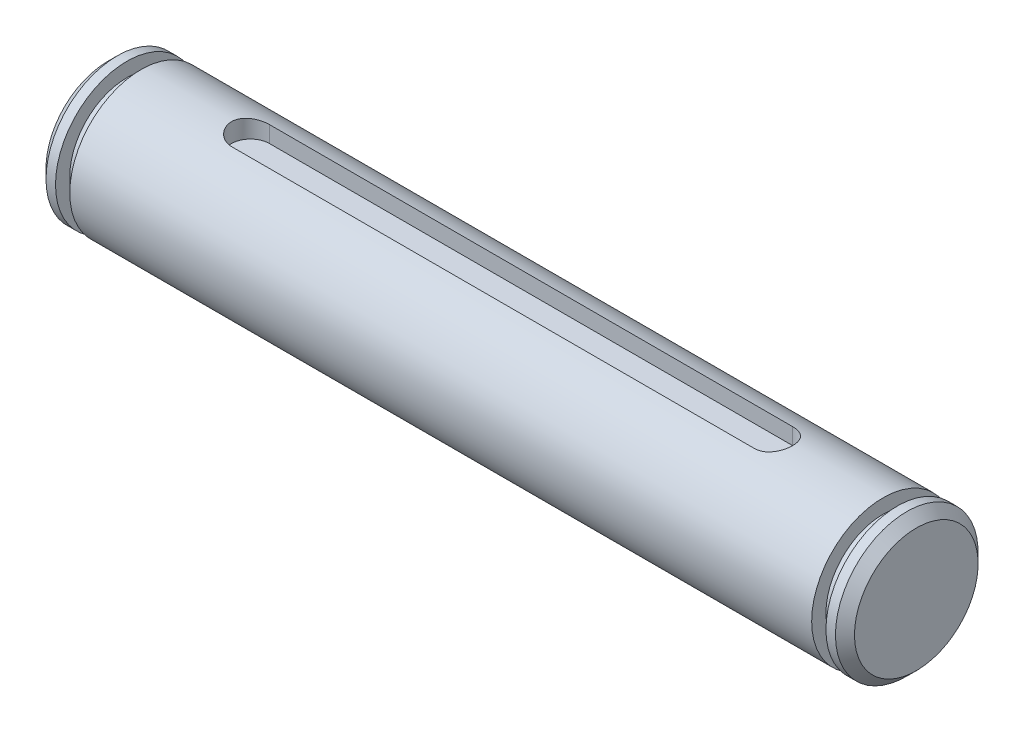
ISO-10303-21;
HEADER;
FILE_DESCRIPTION(('STEP AP214'),'2;1');
FILE_NAME('part.step','',(''),(''),'','','');
FILE_SCHEMA(('AUTOMOTIVE_DESIGN { 1 0 10303 214 1 1 1 1 }'));
ENDSEC;
DATA;
#1=APPLICATION_CONTEXT('core data for automotive mechanical design processes');
#2=APPLICATION_PROTOCOL_DEFINITION('international standard','automotive_design',2000,#1);
#3=PRODUCT_CONTEXT('',#1,'mechanical');
#4=PRODUCT('Part','Part','',(#3));
#5=PRODUCT_RELATED_PRODUCT_CATEGORY('part','',(#4));
#6=PRODUCT_DEFINITION_FORMATION('','',#4);
#7=PRODUCT_DEFINITION_CONTEXT('part definition',#1,'design');
#8=PRODUCT_DEFINITION('design','',#6,#7);
#9=PRODUCT_DEFINITION_SHAPE('','',#8);
#10=(LENGTH_UNIT() NAMED_UNIT(*) SI_UNIT(.MILLI.,.METRE.));
#11=(NAMED_UNIT(*) PLANE_ANGLE_UNIT() SI_UNIT($,.RADIAN.));
#12=(NAMED_UNIT(*) SI_UNIT($,.STERADIAN.) SOLID_ANGLE_UNIT());
#13=UNCERTAINTY_MEASURE_WITH_UNIT(LENGTH_MEASURE(1.E-05),#10,'distance_accuracy_value','');
#14=(GEOMETRIC_REPRESENTATION_CONTEXT(3) GLOBAL_UNCERTAINTY_ASSIGNED_CONTEXT((#13)) GLOBAL_UNIT_ASSIGNED_CONTEXT((#10,
#11,#12)) REPRESENTATION_CONTEXT('',''));
#15=CARTESIAN_POINT('',(0.,0.,0.));
#16=DIRECTION('',(0.,0.,1.));
#17=DIRECTION('',(1.,0.,0.));
#18=AXIS2_PLACEMENT_3D('',#15,#16,#17);
#19=CARTESIAN_POINT('',(-47.1519917646546,0.,0.));
#20=DIRECTION('',(-1.,0.,0.));
#21=DIRECTION('',(0.,0.,1.));
#22=AXIS2_PLACEMENT_3D('',#19,#20,#21);
#23=CYLINDRICAL_SURFACE('',#22,7.50000000000001);
#24=CARTESIAN_POINT('',(39.,0.,0.));
#25=DIRECTION('',(-1.,0.,0.));
#26=DIRECTION('',(0.,0.,1.));
#27=AXIS2_PLACEMENT_3D('',#24,#25,#26);
#28=CIRCLE('',#27,7.50000000000001);
#29=CARTESIAN_POINT('',(39.,0.,7.50000000000001));
#30=VERTEX_POINT('',#29);
#31=EDGE_CURVE('E125',#30,#30,#28,.T.);
#32=ORIENTED_EDGE('',*,*,#31,.T.);
#33=EDGE_LOOP('',(#32));
#34=FACE_BOUND('',#33,.T.);
#35=CARTESIAN_POINT('',(-39.,0.,0.));
#36=DIRECTION('',(-1.,0.,0.));
#37=DIRECTION('',(0.,0.,1.));
#38=AXIS2_PLACEMENT_3D('',#35,#36,#37);
#39=CIRCLE('',#38,7.5);
#40=CARTESIAN_POINT('',(-39.,0.,7.5));
#41=VERTEX_POINT('',#40);
#42=EDGE_CURVE('E122',#41,#41,#39,.T.);
#43=ORIENTED_EDGE('',*,*,#42,.F.);
#44=EDGE_LOOP('',(#43));
#45=FACE_BOUND('',#44,.T.);
#46=CARTESIAN_POINT('',(-27.5,7.22841614740049,-2.));
#47=CARTESIAN_POINT('',(-27.5551947911842,7.22841211731788,-2.00000081983303));
#48=CARTESIAN_POINT('',(-27.61036209501,7.2290491358612,-1.99771369246751));
#49=CARTESIAN_POINT('',(-27.7202814944243,7.2315637554442,-1.9885972357074));
#50=CARTESIAN_POINT('',(-27.775033665217,7.23344112607837,-1.98176874990554));
#51=CARTESIAN_POINT('',(-27.9378283928216,7.24085686185621,-1.95457557497987));
#52=CARTESIAN_POINT('',(-28.0447480667549,7.24817935036392,-1.92750268707176));
#53=CARTESIAN_POINT('',(-28.2523129563665,7.26672221014589,-1.85636209583995));
#54=CARTESIAN_POINT('',(-28.3529592563361,7.2779419056104,-1.81229733890903));
#55=CARTESIAN_POINT('',(-28.5454885830458,7.30300813868027,-1.70848322793951));
#56=CARTESIAN_POINT('',(-28.6373687012198,7.31685554362023,-1.64872869263103));
#57=CARTESIAN_POINT('',(-28.8119913216307,7.34600093818647,-1.51365040710564));
#58=CARTESIAN_POINT('',(-28.8944825380074,7.36132450422142,-1.43800740131203));
#59=CARTESIAN_POINT('',(-29.045777165694,7.39147614932697,-1.27397948568827));
#60=CARTESIAN_POINT('',(-29.114578354886,7.40630414763425,-1.18559251131008));
#61=CARTESIAN_POINT('',(-29.2375865086322,7.43408021450417,-0.996835909868382));
#62=CARTESIAN_POINT('',(-29.2915421011344,7.44699437298772,-0.896297050460056));
#63=CARTESIAN_POINT('',(-29.381686326161,7.46919170417241,-0.687177901515749));
#64=CARTESIAN_POINT('',(-29.4178787925089,7.47847566029373,-0.5785993530168));
#65=CARTESIAN_POINT('',(-29.4706549417801,7.49218546136374,-0.359117146901224));
#66=CARTESIAN_POINT('',(-29.4876686089281,7.49671766938884,-0.248323642566855));
#67=CARTESIAN_POINT('',(-29.5029571541306,7.50078525549961,-0.0253660000268802));
#68=CARTESIAN_POINT('',(-29.5012347613605,7.50032136133914,0.0867979361782012));
#69=CARTESIAN_POINT('',(-29.4794021380377,7.49452674486994,0.306314760877312));
#70=CARTESIAN_POINT('',(-29.4597568596491,7.48931908956448,0.413717637011897));
#71=CARTESIAN_POINT('',(-29.4033875010948,7.47476739620359,0.623642304521197));
#72=CARTESIAN_POINT('',(-29.3666626112576,7.46542316205161,0.726163864239475));
#73=CARTESIAN_POINT('',(-29.2768197266812,7.44346557967562,0.924604944640789));
#74=CARTESIAN_POINT('',(-29.2235422253965,7.43082062276522,1.02044860803469));
#75=CARTESIAN_POINT('',(-29.1022297041967,7.40362439329212,1.20199173400091));
#76=CARTESIAN_POINT('',(-29.0341921037115,7.38907278755842,1.28768941865435));
#77=CARTESIAN_POINT('',(-28.882831825266,7.35911436310182,1.44927650588633));
#78=CARTESIAN_POINT('',(-28.7991051392715,7.34369500037868,1.52478554150251));
#79=CARTESIAN_POINT('',(-28.6199944408082,7.31413713098088,1.66080031054576));
#80=CARTESIAN_POINT('',(-28.5246072136771,7.29999897939885,1.72130189262125));
#81=CARTESIAN_POINT('',(-28.3240420682993,7.27455088700727,1.82587959040844));
#82=CARTESIAN_POINT('',(-28.2188029001336,7.26326050655593,1.86984307275389));
#83=CARTESIAN_POINT('',(-28.0021111221114,7.24503473683016,1.93927349960346));
#84=CARTESIAN_POINT('',(-27.8906681198128,7.23809280698437,1.96476823231962));
#85=CARTESIAN_POINT('',(-27.7318620393524,7.23198573108967,1.98706167698204));
#86=CARTESIAN_POINT('',(-27.6855955577098,7.23064946437023,1.99191398956405));
#87=CARTESIAN_POINT('',(-27.5928935326918,7.22886491746628,1.99837971479533));
#88=CARTESIAN_POINT('',(-27.546458373633,7.22841523283886,1.99999825015569));
#89=CARTESIAN_POINT('',(-27.5,7.22841614740048,2.00000000000001));
#90=B_SPLINE_CURVE_WITH_KNOTS('',3,(#46,#47,#48,#49,#50,#51,#52,#53,#54,#55,#56,#57,#58,#59,#60,
#61,#62,#63,#64,#65,#66,#67,#68,#69,#70,#71,#72,#73,#74,#75,#76,#77,#78,#79,#80,#81,#82,#83,#84,
#85,#86,#87,#88,#89),.UNSPECIFIED.,.F.,.F.,(4,2,2,2,2,2,2,2,2,2,2,2,2,2,2,2,2,2,2,2,2,4),(0.,
0.165479335439025,0.330927940384255,0.660821769203833,0.990658420085614,1.32060413093786,
1.65795310683046,1.9953567954553,2.33816399210233,2.68089716794646,3.01578322846143,
3.35062050868316,3.67701110172494,4.00341716913151,4.33307162311823,4.6627837584895,
5.00258485843319,5.34247984936636,5.68464951048858,6.02630326530912,6.16582316237225,
6.30512186652119),.UNSPECIFIED.);
#91=CARTESIAN_POINT('',(-27.5,7.22841614740049,-2.));
#92=VERTEX_POINT('',#91);
#93=CARTESIAN_POINT('',(-27.5,7.22841614740048,2.00000000000001));
#94=VERTEX_POINT('',#93);
#95=EDGE_CURVE('E11',#92,#94,#90,.T.);
#96=ORIENTED_EDGE('',*,*,#95,.F.);
#97=DIRECTION('',(-1.,0.,0.));
#98=VECTOR('',#97,1.);
#99=CARTESIAN_POINT('',(-47.1519917646546,7.22841614740049,-2.));
#100=LINE('',#99,#98);
#101=CARTESIAN_POINT('',(27.5,7.22841614740048,-2.00000000000001));
#102=VERTEX_POINT('',#101);
#103=EDGE_CURVE('E59',#92,#102,#100,.F.);
#104=ORIENTED_EDGE('',*,*,#103,.T.);
#105=CARTESIAN_POINT('',(27.5,7.22841614740048,2.00000000000001));
#106=CARTESIAN_POINT('',(27.5551947911842,7.22841211731788,2.00000081983305));
#107=CARTESIAN_POINT('',(27.61036209501,7.2290491358612,1.99771369246752));
#108=CARTESIAN_POINT('',(27.7202814944243,7.23156375544419,1.98859723570741));
#109=CARTESIAN_POINT('',(27.775033665217,7.23344112607837,1.98176874990555));
#110=CARTESIAN_POINT('',(27.9378283928216,7.24085686185621,1.95457557497988));
#111=CARTESIAN_POINT('',(28.0447480667549,7.24817935036392,1.92750268707177));
#112=CARTESIAN_POINT('',(28.2523129563665,7.26672221014588,1.85636209583996));
#113=CARTESIAN_POINT('',(28.3529592563361,7.27794190561039,1.81229733890905));
#114=CARTESIAN_POINT('',(28.5454885830458,7.30300813868027,1.70848322793952));
#115=CARTESIAN_POINT('',(28.6373687012198,7.31685554362023,1.64872869263104));
#116=CARTESIAN_POINT('',(28.8119913216307,7.34600093818647,1.51365040710565));
#117=CARTESIAN_POINT('',(28.8944825380074,7.36132450422142,1.43800740131205));
#118=CARTESIAN_POINT('',(29.045777165694,7.39147614932696,1.27397948568828));
#119=CARTESIAN_POINT('',(29.114578354886,7.40630414763424,1.1855925113101));
#120=CARTESIAN_POINT('',(29.2375865086322,7.43408021450417,0.996835909868395));
#121=CARTESIAN_POINT('',(29.2915421011344,7.44699437298772,0.896297050460069));
#122=CARTESIAN_POINT('',(29.381686326161,7.46919170417241,0.687177901515762));
#123=CARTESIAN_POINT('',(29.4178787925089,7.47847566029373,0.578599353016813));
#124=CARTESIAN_POINT('',(29.4706549417801,7.49218546136374,0.359117146901236));
#125=CARTESIAN_POINT('',(29.4876686089281,7.49671766938884,0.248323642566868));
#126=CARTESIAN_POINT('',(29.5029571541306,7.50078525549961,0.0253660000268925));
#127=CARTESIAN_POINT('',(29.5012347613605,7.50032136133914,-0.0867979361781889));
#128=CARTESIAN_POINT('',(29.4794021380377,7.49452674486994,-0.3063147608773));
#129=CARTESIAN_POINT('',(29.4597568596491,7.48931908956448,-0.413717637011884));
#130=CARTESIAN_POINT('',(29.4033875010948,7.47476739620359,-0.623642304521185));
#131=CARTESIAN_POINT('',(29.3666626112576,7.46542316205161,-0.726163864239463));
#132=CARTESIAN_POINT('',(29.2768197266812,7.44346557967562,-0.924604944640777));
#133=CARTESIAN_POINT('',(29.2235422253965,7.43082062276522,-1.02044860803468));
#134=CARTESIAN_POINT('',(29.1022297041967,7.40362439329212,-1.2019917340009));
#135=CARTESIAN_POINT('',(29.0341921037115,7.38907278755843,-1.28768941865434));
#136=CARTESIAN_POINT('',(28.882831825266,7.35911436310182,-1.44927650588632));
#137=CARTESIAN_POINT('',(28.7991051392715,7.34369500037868,-1.5247855415025));
#138=CARTESIAN_POINT('',(28.6199944408082,7.31413713098088,-1.66080031054575));
#139=CARTESIAN_POINT('',(28.5246072136771,7.29999897939885,-1.72130189262124));
#140=CARTESIAN_POINT('',(28.3240420682993,7.27455088700727,-1.82587959040843));
#141=CARTESIAN_POINT('',(28.2188029001336,7.26326050655593,-1.86984307275388));
#142=CARTESIAN_POINT('',(28.0021111221114,7.24503473683016,-1.93927349960345));
#143=CARTESIAN_POINT('',(27.8906681198128,7.23809280698437,-1.96476823231961));
#144=CARTESIAN_POINT('',(27.7318620393524,7.23198573108968,-1.98706167698203));
#145=CARTESIAN_POINT('',(27.6855955577098,7.23064946437023,-1.99191398956404));
#146=CARTESIAN_POINT('',(27.5928935326918,7.22886491746629,-1.99837971479531));
#147=CARTESIAN_POINT('',(27.546458373633,7.22841523283886,-1.99999825015568));
#148=CARTESIAN_POINT('',(27.5,7.22841614740049,-2.));
#149=B_SPLINE_CURVE_WITH_KNOTS('',3,(#105,#106,#107,#108,#109,#110,#111,#112,#113,#114,#115,
#116,#117,#118,#119,#120,#121,#122,#123,#124,#125,#126,#127,#128,#129,#130,#131,#132,#133,#134,
#135,#136,#137,#138,#139,#140,#141,#142,#143,#144,#145,#146,#147,#148),.UNSPECIFIED.,.F.,.F.,(4,
2,2,2,2,2,2,2,2,2,2,2,2,2,2,2,2,2,2,2,2,4),(0.,0.165479335439025,0.330927940384255,
0.660821769203833,0.990658420085614,1.32060413093787,1.65795310683046,1.9953567954553,
2.33816399210233,2.68089716794646,3.01578322846143,3.35062050868316,3.67701110172494,
4.00341716913151,4.33307162311823,4.6627837584895,5.00258485843319,5.34247984936635,
5.68464951048858,6.02630326530912,6.16582316237226,6.30512186652119),.UNSPECIFIED.);
#150=CARTESIAN_POINT('',(27.5,7.22841614740048,2.00000000000001));
#151=VERTEX_POINT('',#150);
#152=EDGE_CURVE('E52',#151,#102,#149,.T.);
#153=ORIENTED_EDGE('',*,*,#152,.F.);
#154=DIRECTION('',(-1.,0.,0.));
#155=VECTOR('',#154,1.);
#156=CARTESIAN_POINT('',(-47.1519917646546,7.22841614740048,2.));
#157=LINE('',#156,#155);
#158=EDGE_CURVE('E149',#151,#94,#157,.T.);
#159=ORIENTED_EDGE('',*,*,#158,.T.);
#160=EDGE_LOOP('',(#96,#104,#153,#159));
#161=FACE_BOUND('',#160,.T.);
#162=ADVANCED_FACE('F39',(#34,#45,#161),#23,.T.);
#163=CARTESIAN_POINT('',(42.5,0.,0.));
#164=DIRECTION('',(-1.,0.,0.));
#165=DIRECTION('',(0.,0.,1.));
#166=AXIS2_PLACEMENT_3D('',#163,#164,#165);
#167=PLANE('',#166);
#168=CARTESIAN_POINT('',(42.5,0.,0.));
#169=DIRECTION('',(-1.,0.,0.));
#170=DIRECTION('',(0.,0.,1.));
#171=AXIS2_PLACEMENT_3D('',#168,#169,#170);
#172=CIRCLE('',#171,6.49999999999998);
#173=CARTESIAN_POINT('',(42.5,0.,6.49999999999998));
#174=VERTEX_POINT('',#173);
#175=EDGE_CURVE('E140',#174,#174,#172,.F.);
#176=ORIENTED_EDGE('',*,*,#175,.T.);
#177=EDGE_LOOP('',(#176));
#178=FACE_BOUND('',#177,.T.);
#179=ADVANCED_FACE('F199',(#178),#167,.F.);
#180=CARTESIAN_POINT('',(-47.1519917646546,0.,0.));
#181=DIRECTION('',(-1.,0.,0.));
#182=DIRECTION('',(0.,0.,1.));
#183=AXIS2_PLACEMENT_3D('',#180,#181,#182);
#184=CYLINDRICAL_SURFACE('',#183,7.50000000000001);
#185=CARTESIAN_POINT('',(41.5,0.,0.));
#186=DIRECTION('',(-1.,0.,0.));
#187=DIRECTION('',(0.,0.,1.));
#188=AXIS2_PLACEMENT_3D('',#185,#186,#187);
#189=CIRCLE('',#188,7.50000000000001);
#190=CARTESIAN_POINT('',(41.5,0.,7.50000000000001));
#191=VERTEX_POINT('',#190);
#192=EDGE_CURVE('E137',#191,#191,#189,.T.);
#193=ORIENTED_EDGE('',*,*,#192,.T.);
#194=EDGE_LOOP('',(#193));
#195=FACE_BOUND('',#194,.T.);
#196=CARTESIAN_POINT('',(40.5,0.,0.));
#197=DIRECTION('',(-1.,0.,0.));
#198=DIRECTION('',(0.,0.,1.));
#199=AXIS2_PLACEMENT_3D('',#196,#197,#198);
#200=CIRCLE('',#199,7.50000000000001);
#201=CARTESIAN_POINT('',(40.5,0.,7.50000000000001));
#202=VERTEX_POINT('',#201);
#203=EDGE_CURVE('E134',#202,#202,#200,.T.);
#204=ORIENTED_EDGE('',*,*,#203,.F.);
#205=EDGE_LOOP('',(#204));
#206=FACE_BOUND('',#205,.T.);
#207=ADVANCED_FACE('F204',(#195,#206),#184,.T.);
#208=CARTESIAN_POINT('',(40.5,7.50000000000001,0.));
#209=DIRECTION('',(1.,0.,0.));
#210=DIRECTION('',(0.,0.,-1.));
#211=AXIS2_PLACEMENT_3D('',#208,#209,#210);
#212=PLANE('',#211);
#213=CARTESIAN_POINT('',(40.5,0.,0.));
#214=DIRECTION('',(-1.,0.,0.));
#215=DIRECTION('',(0.,0.,1.));
#216=AXIS2_PLACEMENT_3D('',#213,#214,#215);
#217=CIRCLE('',#216,6.00000000000001);
#218=CARTESIAN_POINT('',(40.5,0.,6.00000000000001));
#219=VERTEX_POINT('',#218);
#220=EDGE_CURVE('E131',#219,#219,#217,.T.);
#221=ORIENTED_EDGE('',*,*,#220,.F.);
#222=EDGE_LOOP('',(#221));
#223=FACE_BOUND('',#222,.T.);
#224=ORIENTED_EDGE('',*,*,#203,.T.);
#225=EDGE_LOOP('',(#224));
#226=FACE_BOUND('',#225,.T.);
#227=ADVANCED_FACE('F281',(#223,#226),#212,.F.);
#228=CARTESIAN_POINT('',(-47.1519917646546,0.,0.));
#229=DIRECTION('',(-1.,0.,0.));
#230=DIRECTION('',(0.,0.,1.));
#231=AXIS2_PLACEMENT_3D('',#228,#229,#230);
#232=CYLINDRICAL_SURFACE('',#231,6.00000000000001);
#233=CARTESIAN_POINT('',(39.,0.,0.));
#234=DIRECTION('',(-1.,0.,0.));
#235=DIRECTION('',(0.,0.,1.));
#236=AXIS2_PLACEMENT_3D('',#233,#234,#235);
#237=CIRCLE('',#236,6.00000000000001);
#238=CARTESIAN_POINT('',(39.,0.,6.00000000000001));
#239=VERTEX_POINT('',#238);
#240=EDGE_CURVE('E128',#239,#239,#237,.T.);
#241=ORIENTED_EDGE('',*,*,#240,.F.);
#242=EDGE_LOOP('',(#241));
#243=FACE_BOUND('',#242,.T.);
#244=ORIENTED_EDGE('',*,*,#220,.T.);
#245=EDGE_LOOP('',(#244));
#246=FACE_BOUND('',#245,.T.);
#247=ADVANCED_FACE('F194',(#243,#246),#232,.T.);
#248=CARTESIAN_POINT('',(39.,6.00000000000001,0.));
#249=DIRECTION('',(-1.,0.,0.));
#250=DIRECTION('',(0.,0.,1.));
#251=AXIS2_PLACEMENT_3D('',#248,#249,#250);
#252=PLANE('',#251);
#253=ORIENTED_EDGE('',*,*,#31,.F.);
#254=EDGE_LOOP('',(#253));
#255=FACE_BOUND('',#254,.T.);
#256=ORIENTED_EDGE('',*,*,#240,.T.);
#257=EDGE_LOOP('',(#256));
#258=FACE_BOUND('',#257,.T.);
#259=ADVANCED_FACE('F189',(#255,#258),#252,.F.);
#260=CARTESIAN_POINT('',(-39.,6.,0.));
#261=DIRECTION('',(1.,0.,0.));
#262=DIRECTION('',(0.,0.,-1.));
#263=AXIS2_PLACEMENT_3D('',#260,#261,#262);
#264=PLANE('',#263);
#265=CARTESIAN_POINT('',(-39.,0.,0.));
#266=DIRECTION('',(-1.,0.,0.));
#267=DIRECTION('',(0.,0.,1.));
#268=AXIS2_PLACEMENT_3D('',#265,#266,#267);
#269=CIRCLE('',#268,6.);
#270=CARTESIAN_POINT('',(-39.,0.,6.));
#271=VERTEX_POINT('',#270);
#272=EDGE_CURVE('E119',#271,#271,#269,.T.);
#273=ORIENTED_EDGE('',*,*,#272,.F.);
#274=EDGE_LOOP('',(#273));
#275=FACE_BOUND('',#274,.T.);
#276=ORIENTED_EDGE('',*,*,#42,.T.);
#277=EDGE_LOOP('',(#276));
#278=FACE_BOUND('',#277,.T.);
#279=ADVANCED_FACE('F186',(#275,#278),#264,.F.);
#280=CARTESIAN_POINT('',(-47.1519917646546,0.,0.));
#281=DIRECTION('',(-1.,0.,0.));
#282=DIRECTION('',(0.,0.,1.));
#283=AXIS2_PLACEMENT_3D('',#280,#281,#282);
#284=CYLINDRICAL_SURFACE('',#283,6.);
#285=CARTESIAN_POINT('',(-40.5,0.,0.));
#286=DIRECTION('',(-1.,0.,0.));
#287=DIRECTION('',(0.,0.,1.));
#288=AXIS2_PLACEMENT_3D('',#285,#286,#287);
#289=CIRCLE('',#288,6.);
#290=CARTESIAN_POINT('',(-40.5,0.,6.));
#291=VERTEX_POINT('',#290);
#292=EDGE_CURVE('E116',#291,#291,#289,.T.);
#293=ORIENTED_EDGE('',*,*,#292,.F.);
#294=EDGE_LOOP('',(#293));
#295=FACE_BOUND('',#294,.T.);
#296=ORIENTED_EDGE('',*,*,#272,.T.);
#297=EDGE_LOOP('',(#296));
#298=FACE_BOUND('',#297,.T.);
#299=ADVANCED_FACE('F183',(#295,#298),#284,.T.);
#300=CARTESIAN_POINT('',(-40.5,7.5,0.));
#301=DIRECTION('',(-1.,0.,0.));
#302=DIRECTION('',(0.,0.,1.));
#303=AXIS2_PLACEMENT_3D('',#300,#301,#302);
#304=PLANE('',#303);
#305=CARTESIAN_POINT('',(-40.5,0.,0.));
#306=DIRECTION('',(-1.,0.,0.));
#307=DIRECTION('',(0.,0.,1.));
#308=AXIS2_PLACEMENT_3D('',#305,#306,#307);
#309=CIRCLE('',#308,7.5);
#310=CARTESIAN_POINT('',(-40.5,0.,7.5));
#311=VERTEX_POINT('',#310);
#312=EDGE_CURVE('E92',#311,#311,#309,.T.);
#313=ORIENTED_EDGE('',*,*,#312,.F.);
#314=EDGE_LOOP('',(#313));
#315=FACE_BOUND('',#314,.T.);
#316=ORIENTED_EDGE('',*,*,#292,.T.);
#317=EDGE_LOOP('',(#316));
#318=FACE_BOUND('',#317,.T.);
#319=ADVANCED_FACE('F179',(#315,#318),#304,.F.);
#320=CARTESIAN_POINT('',(-47.1519917646546,0.,0.));
#321=DIRECTION('',(-1.,0.,0.));
#322=DIRECTION('',(0.,0.,1.));
#323=AXIS2_PLACEMENT_3D('',#320,#321,#322);
#324=CYLINDRICAL_SURFACE('',#323,7.5);
#325=CARTESIAN_POINT('',(-41.5,0.,0.));
#326=DIRECTION('',(1.,0.,0.));
#327=DIRECTION('',(0.,0.,-1.));
#328=AXIS2_PLACEMENT_3D('',#325,#326,#327);
#329=CIRCLE('',#328,7.5);
#330=CARTESIAN_POINT('',(-41.5,0.,-7.5));
#331=VERTEX_POINT('',#330);
#332=EDGE_CURVE('E146',#331,#331,#329,.T.);
#333=ORIENTED_EDGE('',*,*,#332,.T.);
#334=EDGE_LOOP('',(#333));
#335=FACE_BOUND('',#334,.T.);
#336=ORIENTED_EDGE('',*,*,#312,.T.);
#337=EDGE_LOOP('',(#336));
#338=FACE_BOUND('',#337,.T.);
#339=ADVANCED_FACE('F175',(#335,#338),#324,.T.);
#340=CARTESIAN_POINT('',(-42.5,0.,0.));
#341=DIRECTION('',(1.,0.,0.));
#342=DIRECTION('',(0.,0.,-1.));
#343=AXIS2_PLACEMENT_3D('',#340,#341,#342);
#344=PLANE('',#343);
#345=CARTESIAN_POINT('',(-42.5,0.,0.));
#346=DIRECTION('',(1.,0.,0.));
#347=DIRECTION('',(0.,0.,-1.));
#348=AXIS2_PLACEMENT_3D('',#345,#346,#347);
#349=CIRCLE('',#348,6.50000000000001);
#350=CARTESIAN_POINT('',(-42.5,0.,-6.50000000000001));
#351=VERTEX_POINT('',#350);
#352=EDGE_CURVE('E143',#351,#351,#349,.F.);
#353=ORIENTED_EDGE('',*,*,#352,.T.);
#354=EDGE_LOOP('',(#353));
#355=FACE_BOUND('',#354,.T.);
#356=ADVANCED_FACE('F171',(#355),#344,.F.);
#357=CARTESIAN_POINT('',(41.5,0.,0.));
#358=DIRECTION('',(-1.,0.,0.));
#359=DIRECTION('',(0.,0.,1.));
#360=AXIS2_PLACEMENT_3D('',#357,#358,#359);
#361=CONICAL_SURFACE('',#360,7.50000000000001,0.785398163397457);
#362=ORIENTED_EDGE('',*,*,#175,.F.);
#363=EDGE_LOOP('',(#362));
#364=FACE_BOUND('',#363,.T.);
#365=ORIENTED_EDGE('',*,*,#192,.F.);
#366=EDGE_LOOP('',(#365));
#367=FACE_BOUND('',#366,.T.);
#368=ADVANCED_FACE('F174',(#364,#367),#361,.T.);
#369=CARTESIAN_POINT('',(-42.5,0.,0.));
#370=DIRECTION('',(1.,0.,0.));
#371=DIRECTION('',(0.,0.,-1.));
#372=AXIS2_PLACEMENT_3D('',#369,#370,#371);
#373=CONICAL_SURFACE('',#372,6.50000000000001,0.785398163397442);
#374=ORIENTED_EDGE('',*,*,#332,.F.);
#375=EDGE_LOOP('',(#374));
#376=FACE_BOUND('',#375,.T.);
#377=ORIENTED_EDGE('',*,*,#352,.F.);
#378=EDGE_LOOP('',(#377));
#379=FACE_BOUND('',#378,.T.);
#380=ADVANCED_FACE('F41',(#376,#379),#373,.T.);
#381=CARTESIAN_POINT('',(-10.,9.5,-2.));
#382=DIRECTION('',(0.,0.,-1.));
#383=DIRECTION('',(0.,1.,0.));
#384=AXIS2_PLACEMENT_3D('',#381,#382,#383);
#385=PLANE('',#384);
#386=ORIENTED_EDGE('',*,*,#103,.F.);
#387=DIRECTION('',(0.,-1.,0.));
#388=VECTOR('',#387,1.);
#389=CARTESIAN_POINT('',(-27.5,15.5,-2.));
#390=LINE('',#389,#388);
#391=CARTESIAN_POINT('',(-27.5,5.5,-2.));
#392=VERTEX_POINT('',#391);
#393=EDGE_CURVE('E87',#92,#392,#390,.T.);
#394=ORIENTED_EDGE('',*,*,#393,.T.);
#395=DIRECTION('',(1.,0.,0.));
#396=VECTOR('',#395,1.);
#397=CARTESIAN_POINT('',(-10.,5.5,-2.));
#398=LINE('',#397,#396);
#399=CARTESIAN_POINT('',(27.5,5.5,-2.00000000000001));
#400=VERTEX_POINT('',#399);
#401=EDGE_CURVE('E83',#392,#400,#398,.T.);
#402=ORIENTED_EDGE('',*,*,#401,.T.);
#403=DIRECTION('',(0.,-1.,0.));
#404=VECTOR('',#403,1.);
#405=CARTESIAN_POINT('',(27.5,15.5,-2.00000000000001));
#406=LINE('',#405,#404);
#407=EDGE_CURVE('E86',#102,#400,#406,.T.);
#408=ORIENTED_EDGE('',*,*,#407,.F.);
#409=EDGE_LOOP('',(#386,#394,#402,#408));
#410=FACE_BOUND('',#409,.T.);
#411=ADVANCED_FACE('F85',(#410),#385,.F.);
#412=CARTESIAN_POINT('',(-10.,9.5,2.));
#413=DIRECTION('',(0.,0.,1.));
#414=DIRECTION('',(0.,-1.,0.));
#415=AXIS2_PLACEMENT_3D('',#412,#413,#414);
#416=PLANE('',#415);
#417=ORIENTED_EDGE('',*,*,#158,.F.);
#418=DIRECTION('',(0.,-1.,0.));
#419=VECTOR('',#418,1.);
#420=CARTESIAN_POINT('',(27.5,15.5,2.));
#421=LINE('',#420,#419);
#422=CARTESIAN_POINT('',(27.5,5.5,2.00000000000001));
#423=VERTEX_POINT('',#422);
#424=EDGE_CURVE('E105',#151,#423,#421,.T.);
#425=ORIENTED_EDGE('',*,*,#424,.T.);
#426=DIRECTION('',(1.,0.,0.));
#427=VECTOR('',#426,1.);
#428=CARTESIAN_POINT('',(-10.,5.5,2.));
#429=LINE('',#428,#427);
#430=CARTESIAN_POINT('',(-27.5,5.5,2.00000000000001));
#431=VERTEX_POINT('',#430);
#432=EDGE_CURVE('E93',#431,#423,#429,.T.);
#433=ORIENTED_EDGE('',*,*,#432,.F.);
#434=DIRECTION('',(0.,-1.,0.));
#435=VECTOR('',#434,1.);
#436=CARTESIAN_POINT('',(-27.5,15.5,2.));
#437=LINE('',#436,#435);
#438=EDGE_CURVE('E109',#94,#431,#437,.T.);
#439=ORIENTED_EDGE('',*,*,#438,.F.);
#440=EDGE_LOOP('',(#417,#425,#433,#439));
#441=FACE_BOUND('',#440,.T.);
#442=ADVANCED_FACE('F165',(#441),#416,.F.);
#443=CARTESIAN_POINT('',(-10.,5.5,-2.));
#444=DIRECTION('',(0.,-1.,0.));
#445=DIRECTION('',(0.,0.,-1.));
#446=AXIS2_PLACEMENT_3D('',#443,#444,#445);
#447=PLANE('',#446);
#448=ORIENTED_EDGE('',*,*,#432,.T.);
#449=CARTESIAN_POINT('',(27.5,5.5,0.));
#450=DIRECTION('',(0.,1.,0.));
#451=DIRECTION('',(0.,0.,1.));
#452=AXIS2_PLACEMENT_3D('',#449,#450,#451);
#453=CIRCLE('',#452,2.00000000000001);
#454=EDGE_CURVE('E99',#423,#400,#453,.T.);
#455=ORIENTED_EDGE('',*,*,#454,.T.);
#456=ORIENTED_EDGE('',*,*,#401,.F.);
#457=CARTESIAN_POINT('',(-27.5,5.5,0.));
#458=DIRECTION('',(0.,1.,0.));
#459=DIRECTION('',(0.,0.,1.));
#460=AXIS2_PLACEMENT_3D('',#457,#458,#459);
#461=CIRCLE('',#460,2.00000000000001);
#462=EDGE_CURVE('E103',#392,#431,#461,.T.);
#463=ORIENTED_EDGE('',*,*,#462,.T.);
#464=EDGE_LOOP('',(#448,#455,#456,#463));
#465=FACE_BOUND('',#464,.T.);
#466=ADVANCED_FACE('F101',(#465),#447,.F.);
#467=CARTESIAN_POINT('',(27.5,15.5,0.));
#468=DIRECTION('',(0.,-1.,0.));
#469=DIRECTION('',(0.,0.,-1.));
#470=AXIS2_PLACEMENT_3D('',#467,#468,#469);
#471=CYLINDRICAL_SURFACE('',#470,2.00000000000001);
#472=ORIENTED_EDGE('',*,*,#152,.T.);
#473=ORIENTED_EDGE('',*,*,#407,.T.);
#474=ORIENTED_EDGE('',*,*,#454,.F.);
#475=ORIENTED_EDGE('',*,*,#424,.F.);
#476=EDGE_LOOP('',(#472,#473,#474,#475));
#477=FACE_BOUND('',#476,.T.);
#478=ADVANCED_FACE('F97',(#477),#471,.F.);
#479=CARTESIAN_POINT('',(-27.5,15.5,0.));
#480=DIRECTION('',(0.,-1.,0.));
#481=DIRECTION('',(0.,0.,-1.));
#482=AXIS2_PLACEMENT_3D('',#479,#480,#481);
#483=CYLINDRICAL_SURFACE('',#482,2.00000000000001);
#484=ORIENTED_EDGE('',*,*,#95,.T.);
#485=ORIENTED_EDGE('',*,*,#438,.T.);
#486=ORIENTED_EDGE('',*,*,#462,.F.);
#487=ORIENTED_EDGE('',*,*,#393,.F.);
#488=EDGE_LOOP('',(#484,#485,#486,#487));
#489=FACE_BOUND('',#488,.T.);
#490=ADVANCED_FACE('F161',(#489),#483,.F.);
#491=CLOSED_SHELL('',(#162,#179,#207,#227,#247,#259,#279,#299,#319,#339,#356,#368,#380,#411,
#442,#466,#478,#490));
#492=MANIFOLD_SOLID_BREP('B2',#491);
#493=ADVANCED_BREP_SHAPE_REPRESENTATION('',(#18,#492),#14);
#494=SHAPE_DEFINITION_REPRESENTATION(#9,#493);
ENDSEC;
END-ISO-10303-21;
